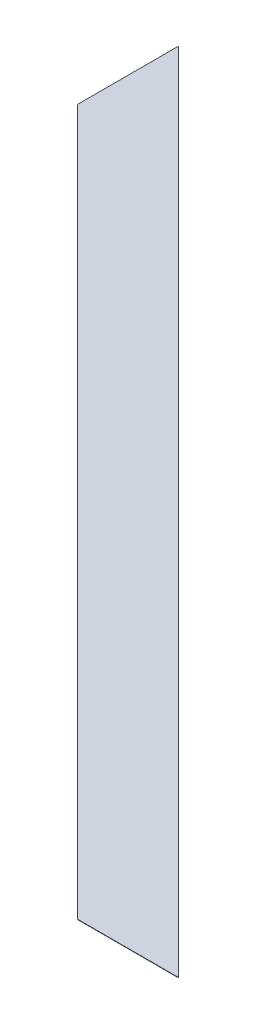
ISO-10303-21;
HEADER;
FILE_DESCRIPTION(('STEP AP214'),'2;1');
FILE_NAME('part.step','',(''),(''),'','','');
FILE_SCHEMA(('AUTOMOTIVE_DESIGN { 1 0 10303 214 1 1 1 1 }'));
ENDSEC;
DATA;
#1=APPLICATION_CONTEXT('core data for automotive mechanical design processes');
#2=APPLICATION_PROTOCOL_DEFINITION('international standard','automotive_design',2000,#1);
#3=PRODUCT_CONTEXT('',#1,'mechanical');
#4=PRODUCT('Part','Part','',(#3));
#5=PRODUCT_RELATED_PRODUCT_CATEGORY('part','',(#4));
#6=PRODUCT_DEFINITION_FORMATION('','',#4);
#7=PRODUCT_DEFINITION_CONTEXT('part definition',#1,'design');
#8=PRODUCT_DEFINITION('design','',#6,#7);
#9=PRODUCT_DEFINITION_SHAPE('','',#8);
#10=(LENGTH_UNIT() NAMED_UNIT(*) SI_UNIT(.MILLI.,.METRE.));
#11=(NAMED_UNIT(*) PLANE_ANGLE_UNIT() SI_UNIT($,.RADIAN.));
#12=(NAMED_UNIT(*) SI_UNIT($,.STERADIAN.) SOLID_ANGLE_UNIT());
#13=UNCERTAINTY_MEASURE_WITH_UNIT(LENGTH_MEASURE(1.E-05),#10,'distance_accuracy_value','');
#14=(GEOMETRIC_REPRESENTATION_CONTEXT(3) GLOBAL_UNCERTAINTY_ASSIGNED_CONTEXT((#13)) GLOBAL_UNIT_ASSIGNED_CONTEXT((#10,
#11,#12)) REPRESENTATION_CONTEXT('',''));
#15=CARTESIAN_POINT('',(0.,0.,0.));
#16=DIRECTION('',(0.,0.,1.));
#17=DIRECTION('',(1.,0.,0.));
#18=AXIS2_PLACEMENT_3D('',#15,#16,#17);
#19=CARTESIAN_POINT('',(0.,0.,0.));
#20=DIRECTION('',(0.,1.,0.));
#21=DIRECTION('',(0.,0.,1.));
#22=AXIS2_PLACEMENT_3D('',#19,#20,#21);
#23=PLANE('',#22);
#24=DIRECTION('',(0.707106781186548,0.,0.707106781186548));
#25=VECTOR('',#24,1.);
#26=CARTESIAN_POINT('',(285.75,0.,-285.75));
#27=LINE('',#26,#25);
#28=CARTESIAN_POINT('',(0.,0.,-571.5));
#29=VERTEX_POINT('',#28);
#30=CARTESIAN_POINT('',(571.5,0.,0.));
#31=VERTEX_POINT('',#30);
#32=EDGE_CURVE('E81',#29,#31,#27,.T.);
#33=ORIENTED_EDGE('',*,*,#32,.T.);
#34=DIRECTION('',(-1.,0.,0.));
#35=VECTOR('',#34,1.);
#36=CARTESIAN_POINT('',(0.,0.,0.));
#37=LINE('',#36,#35);
#38=CARTESIAN_POINT('',(499.657951031447,0.,0.));
#39=VERTEX_POINT('',#38);
#40=EDGE_CURVE('E68',#31,#39,#37,.T.);
#41=ORIENTED_EDGE('',*,*,#40,.T.);
#42=DIRECTION('',(-0.707106781186548,0.,-0.707106781186547));
#43=VECTOR('',#42,1.);
#44=CARTESIAN_POINT('',(249.828975515723,0.,-249.828975515723));
#45=LINE('',#44,#43);
#46=CARTESIAN_POINT('',(0.,0.,-499.657951031447));
#47=VERTEX_POINT('',#46);
#48=EDGE_CURVE('E55',#39,#47,#45,.T.);
#49=ORIENTED_EDGE('',*,*,#48,.T.);
#50=DIRECTION('',(0.,0.,-1.));
#51=VECTOR('',#50,1.);
#52=CARTESIAN_POINT('',(0.,0.,0.));
#53=LINE('',#52,#51);
#54=EDGE_CURVE('E20',#47,#29,#53,.T.);
#55=ORIENTED_EDGE('',*,*,#54,.T.);
#56=EDGE_LOOP('',(#33,#41,#49,#55));
#57=FACE_BOUND('',#56,.T.);
#58=ADVANCED_FACE('F17',(#57),#23,.F.);
#59=CARTESIAN_POINT('',(0.,0.254,0.));
#60=DIRECTION('',(1.,0.,0.));
#61=DIRECTION('',(0.,0.,-1.));
#62=AXIS2_PLACEMENT_3D('',#59,#60,#61);
#63=PLANE('',#62);
#64=DIRECTION('',(0.,1.,0.));
#65=VECTOR('',#64,1.);
#66=CARTESIAN_POINT('',(0.,0.254,-499.657951031447));
#67=LINE('',#66,#65);
#68=CARTESIAN_POINT('',(0.,0.254,-499.657951031447));
#69=VERTEX_POINT('',#68);
#70=EDGE_CURVE('E61',#47,#69,#67,.T.);
#71=ORIENTED_EDGE('',*,*,#70,.T.);
#72=DIRECTION('',(0.,0.,1.));
#73=VECTOR('',#72,1.);
#74=CARTESIAN_POINT('',(0.,0.254,0.));
#75=LINE('',#74,#73);
#76=CARTESIAN_POINT('',(0.,0.254,-571.5));
#77=VERTEX_POINT('',#76);
#78=EDGE_CURVE('E83',#77,#69,#75,.T.);
#79=ORIENTED_EDGE('',*,*,#78,.F.);
#80=DIRECTION('',(0.,1.,0.));
#81=VECTOR('',#80,1.);
#82=CARTESIAN_POINT('',(0.,0.254,-571.5));
#83=LINE('',#82,#81);
#84=EDGE_CURVE('E64',#77,#29,#83,.F.);
#85=ORIENTED_EDGE('',*,*,#84,.T.);
#86=ORIENTED_EDGE('',*,*,#54,.F.);
#87=EDGE_LOOP('',(#71,#79,#85,#86));
#88=FACE_BOUND('',#87,.T.);
#89=ADVANCED_FACE('F60',(#88),#63,.F.);
#90=CARTESIAN_POINT('',(249.828975515723,0.254,-249.828975515723));
#91=DIRECTION('',(0.707106781186547,0.,-0.707106781186548));
#92=DIRECTION('',(-0.707106781186548,0.,-0.707106781186547));
#93=AXIS2_PLACEMENT_3D('',#90,#91,#92);
#94=PLANE('',#93);
#95=DIRECTION('',(0.,1.,0.));
#96=VECTOR('',#95,1.);
#97=CARTESIAN_POINT('',(499.657951031447,0.254,0.));
#98=LINE('',#97,#96);
#99=CARTESIAN_POINT('',(499.657951031447,0.254,0.));
#100=VERTEX_POINT('',#99);
#101=EDGE_CURVE('E70',#39,#100,#98,.T.);
#102=ORIENTED_EDGE('',*,*,#101,.T.);
#103=DIRECTION('',(0.707106781186548,0.,0.707106781186547));
#104=VECTOR('',#103,1.);
#105=CARTESIAN_POINT('',(0.,0.254,-499.657951031447));
#106=LINE('',#105,#104);
#107=EDGE_CURVE('E74',#69,#100,#106,.T.);
#108=ORIENTED_EDGE('',*,*,#107,.F.);
#109=ORIENTED_EDGE('',*,*,#70,.F.);
#110=ORIENTED_EDGE('',*,*,#48,.F.);
#111=EDGE_LOOP('',(#102,#108,#109,#110));
#112=FACE_BOUND('',#111,.T.);
#113=ADVANCED_FACE('F72',(#112),#94,.F.);
#114=CARTESIAN_POINT('',(0.,0.254,0.));
#115=DIRECTION('',(0.,0.,-1.));
#116=DIRECTION('',(-1.,0.,0.));
#117=AXIS2_PLACEMENT_3D('',#114,#115,#116);
#118=PLANE('',#117);
#119=DIRECTION('',(0.,1.,0.));
#120=VECTOR('',#119,1.);
#121=CARTESIAN_POINT('',(571.5,0.254,0.));
#122=LINE('',#121,#120);
#123=CARTESIAN_POINT('',(571.5,0.254,0.));
#124=VERTEX_POINT('',#123);
#125=EDGE_CURVE('E35',#31,#124,#122,.T.);
#126=ORIENTED_EDGE('',*,*,#125,.T.);
#127=DIRECTION('',(1.,0.,0.));
#128=VECTOR('',#127,1.);
#129=CARTESIAN_POINT('',(0.,0.254,0.));
#130=LINE('',#129,#128);
#131=EDGE_CURVE('E26',#100,#124,#130,.T.);
#132=ORIENTED_EDGE('',*,*,#131,.F.);
#133=ORIENTED_EDGE('',*,*,#101,.F.);
#134=ORIENTED_EDGE('',*,*,#40,.F.);
#135=EDGE_LOOP('',(#126,#132,#133,#134));
#136=FACE_BOUND('',#135,.T.);
#137=ADVANCED_FACE('F89',(#136),#118,.F.);
#138=CARTESIAN_POINT('',(285.75,0.254,-285.75));
#139=DIRECTION('',(-0.707106781186548,0.,0.707106781186548));
#140=DIRECTION('',(0.707106781186548,0.,0.707106781186548));
#141=AXIS2_PLACEMENT_3D('',#138,#139,#140);
#142=PLANE('',#141);
#143=ORIENTED_EDGE('',*,*,#84,.F.);
#144=DIRECTION('',(-0.707106781186548,0.,-0.707106781186548));
#145=VECTOR('',#144,1.);
#146=CARTESIAN_POINT('',(571.5,0.254,0.));
#147=LINE('',#146,#145);
#148=EDGE_CURVE('E11',#124,#77,#147,.T.);
#149=ORIENTED_EDGE('',*,*,#148,.F.);
#150=ORIENTED_EDGE('',*,*,#125,.F.);
#151=ORIENTED_EDGE('',*,*,#32,.F.);
#152=EDGE_LOOP('',(#143,#149,#150,#151));
#153=FACE_BOUND('',#152,.T.);
#154=ADVANCED_FACE('F91',(#153),#142,.F.);
#155=CARTESIAN_POINT('',(0.,0.254,0.));
#156=DIRECTION('',(0.,1.,0.));
#157=DIRECTION('',(0.,0.,1.));
#158=AXIS2_PLACEMENT_3D('',#155,#156,#157);
#159=PLANE('',#158);
#160=ORIENTED_EDGE('',*,*,#131,.T.);
#161=ORIENTED_EDGE('',*,*,#148,.T.);
#162=ORIENTED_EDGE('',*,*,#78,.T.);
#163=ORIENTED_EDGE('',*,*,#107,.T.);
#164=EDGE_LOOP('',(#160,#161,#162,#163));
#165=FACE_BOUND('',#164,.T.);
#166=ADVANCED_FACE('F88',(#165),#159,.T.);
#167=CLOSED_SHELL('',(#58,#89,#113,#137,#154,#166));
#168=MANIFOLD_SOLID_BREP('B1',#167);
#169=ADVANCED_BREP_SHAPE_REPRESENTATION('',(#18,#168),#14);
#170=SHAPE_DEFINITION_REPRESENTATION(#9,#169);
ENDSEC;
END-ISO-10303-21;
